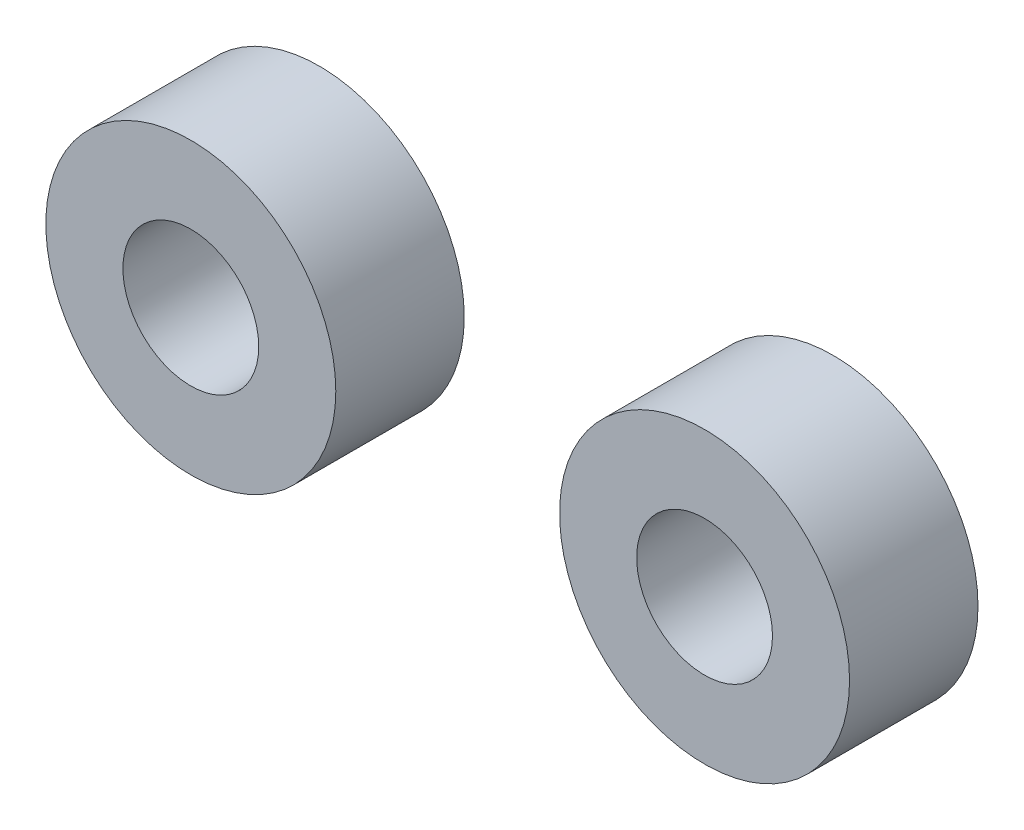
ISO-10303-21;
HEADER;
FILE_DESCRIPTION(('STEP AP214'),'2;1');
FILE_NAME('part.step','',(''),(''),'','','');
FILE_SCHEMA(('AUTOMOTIVE_DESIGN { 1 0 10303 214 1 1 1 1 }'));
ENDSEC;
DATA;
#1=APPLICATION_CONTEXT('core data for automotive mechanical design processes');
#2=APPLICATION_PROTOCOL_DEFINITION('international standard','automotive_design',2000,#1);
#3=PRODUCT_CONTEXT('',#1,'mechanical');
#4=PRODUCT('Part','Part','',(#3));
#5=PRODUCT_RELATED_PRODUCT_CATEGORY('part','',(#4));
#6=PRODUCT_DEFINITION_FORMATION('','',#4);
#7=PRODUCT_DEFINITION_CONTEXT('part definition',#1,'design');
#8=PRODUCT_DEFINITION('design','',#6,#7);
#9=PRODUCT_DEFINITION_SHAPE('','',#8);
#10=(LENGTH_UNIT() NAMED_UNIT(*) SI_UNIT(.MILLI.,.METRE.));
#11=(NAMED_UNIT(*) PLANE_ANGLE_UNIT() SI_UNIT($,.RADIAN.));
#12=(NAMED_UNIT(*) SI_UNIT($,.STERADIAN.) SOLID_ANGLE_UNIT());
#13=UNCERTAINTY_MEASURE_WITH_UNIT(LENGTH_MEASURE(1.E-05),#10,'distance_accuracy_value','');
#14=(GEOMETRIC_REPRESENTATION_CONTEXT(3) GLOBAL_UNCERTAINTY_ASSIGNED_CONTEXT((#13)) GLOBAL_UNIT_ASSIGNED_CONTEXT((#10,
#11,#12)) REPRESENTATION_CONTEXT('',''));
#15=CARTESIAN_POINT('',(0.,0.,0.));
#16=DIRECTION('',(0.,0.,1.));
#17=DIRECTION('',(1.,0.,0.));
#18=AXIS2_PLACEMENT_3D('',#15,#16,#17);
#19=CARTESIAN_POINT('',(-29.961022301993,14.6407799148918,5.));
#20=DIRECTION('',(0.,0.,1.));
#21=DIRECTION('',(1.,0.,0.));
#22=AXIS2_PLACEMENT_3D('',#19,#20,#21);
#23=PLANE('',#22);
#24=CARTESIAN_POINT('',(-29.961022301993,14.6407799148918,5.));
#25=DIRECTION('',(0.,0.,1.));
#26=DIRECTION('',(1.,0.,0.));
#27=AXIS2_PLACEMENT_3D('',#24,#25,#26);
#28=CIRCLE('',#27,5.64361385213644);
#29=CARTESIAN_POINT('',(-24.3174084498566,14.6407799148918,5.));
#30=VERTEX_POINT('',#29);
#31=EDGE_CURVE('E59',#30,#30,#28,.T.);
#32=ORIENTED_EDGE('',*,*,#31,.T.);
#33=EDGE_LOOP('',(#32));
#34=FACE_BOUND('',#33,.T.);
#35=CARTESIAN_POINT('',(-29.961022301993,14.6407799148918,5.));
#36=DIRECTION('',(0.,0.,1.));
#37=DIRECTION('',(1.,0.,0.));
#38=AXIS2_PLACEMENT_3D('',#35,#36,#37);
#39=CIRCLE('',#38,2.64361385213644);
#40=CARTESIAN_POINT('',(-27.3174084498566,14.6407799148918,5.));
#41=VERTEX_POINT('',#40);
#42=EDGE_CURVE('E50',#41,#41,#39,.T.);
#43=ORIENTED_EDGE('',*,*,#42,.F.);
#44=EDGE_LOOP('',(#43));
#45=FACE_BOUND('',#44,.T.);
#46=ADVANCED_FACE('F46',(#34,#45),#23,.T.);
#47=CARTESIAN_POINT('',(-29.961022301993,14.6407799148918,0.));
#48=DIRECTION('',(0.,0.,1.));
#49=DIRECTION('',(1.,0.,0.));
#50=AXIS2_PLACEMENT_3D('',#47,#48,#49);
#51=PLANE('',#50);
#52=CARTESIAN_POINT('',(-29.961022301993,14.6407799148918,0.));
#53=DIRECTION('',(0.,0.,1.));
#54=DIRECTION('',(1.,0.,0.));
#55=AXIS2_PLACEMENT_3D('',#52,#53,#54);
#56=CIRCLE('',#55,5.64361385213644);
#57=CARTESIAN_POINT('',(-24.3174084498566,14.6407799148918,0.));
#58=VERTEX_POINT('',#57);
#59=EDGE_CURVE('E57',#58,#58,#56,.T.);
#60=ORIENTED_EDGE('',*,*,#59,.F.);
#61=EDGE_LOOP('',(#60));
#62=FACE_BOUND('',#61,.T.);
#63=CARTESIAN_POINT('',(-29.961022301993,14.6407799148918,0.));
#64=DIRECTION('',(0.,0.,1.));
#65=DIRECTION('',(1.,0.,0.));
#66=AXIS2_PLACEMENT_3D('',#63,#64,#65);
#67=CIRCLE('',#66,2.64361385213644);
#68=CARTESIAN_POINT('',(-27.3174084498566,14.6407799148918,0.));
#69=VERTEX_POINT('',#68);
#70=EDGE_CURVE('E11',#69,#69,#67,.T.);
#71=ORIENTED_EDGE('',*,*,#70,.T.);
#72=EDGE_LOOP('',(#71));
#73=FACE_BOUND('',#72,.T.);
#74=ADVANCED_FACE('F67',(#62,#73),#51,.F.);
#75=CARTESIAN_POINT('',(-29.961022301993,14.6407799148918,5.));
#76=DIRECTION('',(0.,0.,-1.));
#77=DIRECTION('',(-1.,0.,0.));
#78=AXIS2_PLACEMENT_3D('',#75,#76,#77);
#79=CYLINDRICAL_SURFACE('',#78,5.64361385213644);
#80=ORIENTED_EDGE('',*,*,#31,.F.);
#81=EDGE_LOOP('',(#80));
#82=FACE_BOUND('',#81,.T.);
#83=ORIENTED_EDGE('',*,*,#59,.T.);
#84=EDGE_LOOP('',(#83));
#85=FACE_BOUND('',#84,.T.);
#86=ADVANCED_FACE('F65',(#82,#85),#79,.T.);
#87=CARTESIAN_POINT('',(-29.961022301993,14.6407799148918,5.));
#88=DIRECTION('',(0.,0.,-1.));
#89=DIRECTION('',(-1.,0.,0.));
#90=AXIS2_PLACEMENT_3D('',#87,#88,#89);
#91=CYLINDRICAL_SURFACE('',#90,2.64361385213644);
#92=ORIENTED_EDGE('',*,*,#42,.T.);
#93=EDGE_LOOP('',(#92));
#94=FACE_BOUND('',#93,.T.);
#95=ORIENTED_EDGE('',*,*,#70,.F.);
#96=EDGE_LOOP('',(#95));
#97=FACE_BOUND('',#96,.T.);
#98=ADVANCED_FACE('F48',(#94,#97),#91,.F.);
#99=CLOSED_SHELL('',(#46,#74,#86,#98));
#100=MANIFOLD_SOLID_BREP('B2',#99);
#101=CARTESIAN_POINT('',(-49.9594664277311,14.3913153888914,5.));
#102=DIRECTION('',(0.,0.,1.));
#103=DIRECTION('',(1.,0.,0.));
#104=AXIS2_PLACEMENT_3D('',#101,#102,#103);
#105=PLANE('',#104);
#106=CARTESIAN_POINT('',(-49.9594664277311,14.3913153888914,5.));
#107=DIRECTION('',(0.,0.,1.));
#108=DIRECTION('',(1.,0.,0.));
#109=AXIS2_PLACEMENT_3D('',#106,#107,#108);
#110=CIRCLE('',#109,5.64361385213644);
#111=CARTESIAN_POINT('',(-44.3158525755947,14.3913153888914,5.));
#112=VERTEX_POINT('',#111);
#113=EDGE_CURVE('E45',#112,#112,#110,.T.);
#114=ORIENTED_EDGE('',*,*,#113,.T.);
#115=EDGE_LOOP('',(#114));
#116=FACE_BOUND('',#115,.T.);
#117=CARTESIAN_POINT('',(-49.9594664277311,14.3913153888914,5.));
#118=DIRECTION('',(0.,0.,1.));
#119=DIRECTION('',(1.,0.,0.));
#120=AXIS2_PLACEMENT_3D('',#117,#118,#119);
#121=CIRCLE('',#120,2.64361385213644);
#122=CARTESIAN_POINT('',(-47.3158525755947,14.3913153888914,5.));
#123=VERTEX_POINT('',#122);
#124=EDGE_CURVE('E126',#123,#123,#121,.T.);
#125=ORIENTED_EDGE('',*,*,#124,.F.);
#126=EDGE_LOOP('',(#125));
#127=FACE_BOUND('',#126,.T.);
#128=ADVANCED_FACE('F115',(#116,#127),#105,.T.);
#129=CARTESIAN_POINT('',(-49.9594664277311,14.3913153888914,0.));
#130=DIRECTION('',(0.,0.,1.));
#131=DIRECTION('',(1.,0.,0.));
#132=AXIS2_PLACEMENT_3D('',#129,#130,#131);
#133=PLANE('',#132);
#134=CARTESIAN_POINT('',(-49.9594664277311,14.3913153888914,0.));
#135=DIRECTION('',(0.,0.,1.));
#136=DIRECTION('',(1.,0.,0.));
#137=AXIS2_PLACEMENT_3D('',#134,#135,#136);
#138=CIRCLE('',#137,5.64361385213644);
#139=CARTESIAN_POINT('',(-44.3158525755947,14.3913153888914,0.));
#140=VERTEX_POINT('',#139);
#141=EDGE_CURVE('E119',#140,#140,#138,.T.);
#142=ORIENTED_EDGE('',*,*,#141,.F.);
#143=EDGE_LOOP('',(#142));
#144=FACE_BOUND('',#143,.T.);
#145=CARTESIAN_POINT('',(-49.9594664277311,14.3913153888914,0.));
#146=DIRECTION('',(0.,0.,1.));
#147=DIRECTION('',(1.,0.,0.));
#148=AXIS2_PLACEMENT_3D('',#145,#146,#147);
#149=CIRCLE('',#148,2.64361385213644);
#150=CARTESIAN_POINT('',(-47.3158525755947,14.3913153888914,0.));
#151=VERTEX_POINT('',#150);
#152=EDGE_CURVE('E128',#151,#151,#149,.T.);
#153=ORIENTED_EDGE('',*,*,#152,.T.);
#154=EDGE_LOOP('',(#153));
#155=FACE_BOUND('',#154,.T.);
#156=ADVANCED_FACE('F138',(#144,#155),#133,.F.);
#157=CARTESIAN_POINT('',(-49.9594664277311,14.3913153888914,5.));
#158=DIRECTION('',(0.,0.,-1.));
#159=DIRECTION('',(-1.,0.,0.));
#160=AXIS2_PLACEMENT_3D('',#157,#158,#159);
#161=CYLINDRICAL_SURFACE('',#160,5.64361385213644);
#162=ORIENTED_EDGE('',*,*,#113,.F.);
#163=EDGE_LOOP('',(#162));
#164=FACE_BOUND('',#163,.T.);
#165=ORIENTED_EDGE('',*,*,#141,.T.);
#166=EDGE_LOOP('',(#165));
#167=FACE_BOUND('',#166,.T.);
#168=ADVANCED_FACE('F117',(#164,#167),#161,.T.);
#169=CARTESIAN_POINT('',(-49.9594664277311,14.3913153888914,5.));
#170=DIRECTION('',(0.,0.,-1.));
#171=DIRECTION('',(-1.,0.,0.));
#172=AXIS2_PLACEMENT_3D('',#169,#170,#171);
#173=CYLINDRICAL_SURFACE('',#172,2.64361385213644);
#174=ORIENTED_EDGE('',*,*,#124,.T.);
#175=EDGE_LOOP('',(#174));
#176=FACE_BOUND('',#175,.T.);
#177=ORIENTED_EDGE('',*,*,#152,.F.);
#178=EDGE_LOOP('',(#177));
#179=FACE_BOUND('',#178,.T.);
#180=ADVANCED_FACE('F134',(#176,#179),#173,.F.);
#181=CLOSED_SHELL('',(#128,#156,#168,#180));
#182=MANIFOLD_SOLID_BREP('B6',#181);
#183=ADVANCED_BREP_SHAPE_REPRESENTATION('',(#18,#100,#182),#14);
#184=SHAPE_DEFINITION_REPRESENTATION(#9,#183);
ENDSEC;
END-ISO-10303-21;
